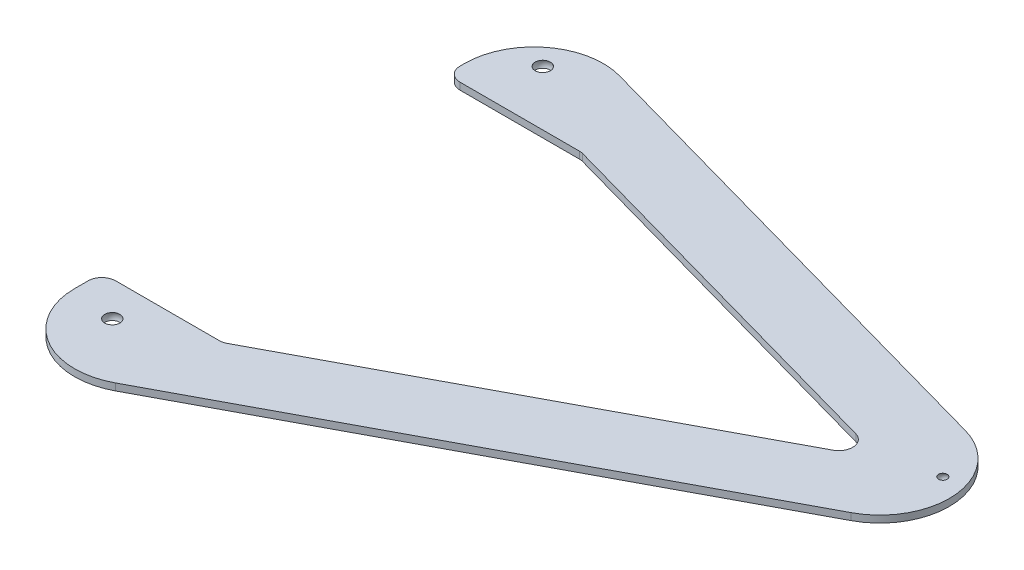
ISO-10303-21;
HEADER;
FILE_DESCRIPTION(('STEP AP214'),'2;1');
FILE_NAME('part.step','',(''),(''),'','','');
FILE_SCHEMA(('AUTOMOTIVE_DESIGN { 1 0 10303 214 1 1 1 1 }'));
ENDSEC;
DATA;
#1=APPLICATION_CONTEXT('core data for automotive mechanical design processes');
#2=APPLICATION_PROTOCOL_DEFINITION('international standard','automotive_design',2000,#1);
#3=PRODUCT_CONTEXT('',#1,'mechanical');
#4=PRODUCT('Part','Part','',(#3));
#5=PRODUCT_RELATED_PRODUCT_CATEGORY('part','',(#4));
#6=PRODUCT_DEFINITION_FORMATION('','',#4);
#7=PRODUCT_DEFINITION_CONTEXT('part definition',#1,'design');
#8=PRODUCT_DEFINITION('design','',#6,#7);
#9=PRODUCT_DEFINITION_SHAPE('','',#8);
#10=(LENGTH_UNIT() NAMED_UNIT(*) SI_UNIT(.MILLI.,.METRE.));
#11=(NAMED_UNIT(*) PLANE_ANGLE_UNIT() SI_UNIT($,.RADIAN.));
#12=(NAMED_UNIT(*) SI_UNIT($,.STERADIAN.) SOLID_ANGLE_UNIT());
#13=UNCERTAINTY_MEASURE_WITH_UNIT(LENGTH_MEASURE(1.E-05),#10,'distance_accuracy_value','');
#14=(GEOMETRIC_REPRESENTATION_CONTEXT(3) GLOBAL_UNCERTAINTY_ASSIGNED_CONTEXT((#13)) GLOBAL_UNIT_ASSIGNED_CONTEXT((#10,
#11,#12)) REPRESENTATION_CONTEXT('',''));
#15=CARTESIAN_POINT('',(0.,0.,0.));
#16=DIRECTION('',(0.,0.,1.));
#17=DIRECTION('',(1.,0.,0.));
#18=AXIS2_PLACEMENT_3D('',#15,#16,#17);
#19=CARTESIAN_POINT('',(0.,5.,0.));
#20=DIRECTION('',(-1.,0.,0.));
#21=DIRECTION('',(0.,0.,1.));
#22=AXIS2_PLACEMENT_3D('',#19,#20,#21);
#23=PLANE('',#22);
#24=DIRECTION('',(0.,0.,-1.));
#25=VECTOR('',#24,1.);
#26=CARTESIAN_POINT('',(0.,0.,0.));
#27=LINE('',#26,#25);
#28=CARTESIAN_POINT('',(0.,0.,-360.837718086647));
#29=VERTEX_POINT('',#28);
#30=CARTESIAN_POINT('',(0.,0.,-364.097258810454));
#31=VERTEX_POINT('',#30);
#32=EDGE_CURVE('E286',#29,#31,#27,.T.);
#33=ORIENTED_EDGE('',*,*,#32,.F.);
#34=DIRECTION('',(0.,-1.,0.));
#35=VECTOR('',#34,1.);
#36=CARTESIAN_POINT('',(0.,5.,-360.837718086647));
#37=LINE('',#36,#35);
#38=CARTESIAN_POINT('',(0.,5.,-360.837718086647));
#39=VERTEX_POINT('',#38);
#40=EDGE_CURVE('E239',#29,#39,#37,.F.);
#41=ORIENTED_EDGE('',*,*,#40,.T.);
#42=DIRECTION('',(0.,0.,-1.));
#43=VECTOR('',#42,1.);
#44=CARTESIAN_POINT('',(0.,5.,0.));
#45=LINE('',#44,#43);
#46=CARTESIAN_POINT('',(0.,5.,-364.097258810454));
#47=VERTEX_POINT('',#46);
#48=EDGE_CURVE('E161',#39,#47,#45,.T.);
#49=ORIENTED_EDGE('',*,*,#48,.T.);
#50=DIRECTION('',(0.,-1.,0.));
#51=VECTOR('',#50,1.);
#52=CARTESIAN_POINT('',(0.,5.,-364.097258810454));
#53=LINE('',#52,#51);
#54=EDGE_CURVE('E171',#47,#31,#53,.T.);
#55=ORIENTED_EDGE('',*,*,#54,.T.);
#56=EDGE_LOOP('',(#33,#41,#49,#55));
#57=FACE_BOUND('',#56,.T.);
#58=ADVANCED_FACE('F37',(#57),#23,.T.);
#59=CARTESIAN_POINT('',(0.,5.,-83.245567818374));
#60=VERTEX_POINT('',#59);
#61=CARTESIAN_POINT('',(0.,5.,-92.9222846828418));
#62=VERTEX_POINT('',#61);
#63=EDGE_CURVE('E287',#60,#62,#45,.T.);
#64=ORIENTED_EDGE('',*,*,#63,.T.);
#65=DIRECTION('',(0.,1.,0.));
#66=VECTOR('',#65,1.);
#67=CARTESIAN_POINT('',(0.,0.,-92.9222846828418));
#68=LINE('',#67,#66);
#69=CARTESIAN_POINT('',(0.,0.,-92.9222846828418));
#70=VERTEX_POINT('',#69);
#71=EDGE_CURVE('E227',#62,#70,#68,.F.);
#72=ORIENTED_EDGE('',*,*,#71,.T.);
#73=CARTESIAN_POINT('',(0.,0.,-83.245567818374));
#74=VERTEX_POINT('',#73);
#75=EDGE_CURVE('E292',#74,#70,#27,.T.);
#76=ORIENTED_EDGE('',*,*,#75,.F.);
#77=DIRECTION('',(0.,-1.,0.));
#78=VECTOR('',#77,1.);
#79=CARTESIAN_POINT('',(0.,5.,-83.245567818374));
#80=LINE('',#79,#78);
#81=EDGE_CURVE('E170',#74,#60,#80,.F.);
#82=ORIENTED_EDGE('',*,*,#81,.T.);
#83=EDGE_LOOP('',(#64,#72,#76,#82));
#84=FACE_BOUND('',#83,.T.);
#85=ADVANCED_FACE('F312',(#84),#23,.T.);
#86=CARTESIAN_POINT('',(529.674124537375,5.,-281.860465116279));
#87=DIRECTION('',(0.469767441860465,0.,0.882790207562292));
#88=DIRECTION('',(0.882790207562292,0.,-0.469767441860465));
#89=AXIS2_PLACEMENT_3D('',#86,#87,#88);
#90=PLANE('',#89);
#91=DIRECTION('',(-0.882790207562292,0.,0.469767441860465));
#92=VECTOR('',#91,1.);
#93=CARTESIAN_POINT('',(529.674124537375,0.,-281.860465116279));
#94=LINE('',#93,#92);
#95=CARTESIAN_POINT('',(419.44156639784,0.,-223.20137895589));
#96=VERTEX_POINT('',#95);
#97=CARTESIAN_POINT('',(73.4883720930232,0.,-39.1060574402594));
#98=VERTEX_POINT('',#97);
#99=EDGE_CURVE('E149',#96,#98,#94,.T.);
#100=ORIENTED_EDGE('',*,*,#99,.F.);
#101=DIRECTION('',(0.,-1.,0.));
#102=VECTOR('',#101,1.);
#103=CARTESIAN_POINT('',(419.44156639784,5.,-223.20137895589));
#104=LINE('',#103,#102);
#105=CARTESIAN_POINT('',(419.44156639784,5.,-223.20137895589));
#106=VERTEX_POINT('',#105);
#107=EDGE_CURVE('E211',#96,#106,#104,.F.);
#108=ORIENTED_EDGE('',*,*,#107,.T.);
#109=DIRECTION('',(-0.882790207562292,0.,0.469767441860465));
#110=VECTOR('',#109,1.);
#111=CARTESIAN_POINT('',(529.674124537375,5.,-281.860465116279));
#112=LINE('',#111,#110);
#113=CARTESIAN_POINT('',(73.4883720930232,5.,-39.1060574402594));
#114=VERTEX_POINT('',#113);
#115=EDGE_CURVE('E176',#106,#114,#112,.T.);
#116=ORIENTED_EDGE('',*,*,#115,.T.);
#117=DIRECTION('',(0.,-1.,0.));
#118=VECTOR('',#117,1.);
#119=CARTESIAN_POINT('',(73.4883720930232,5.,-39.1060574402594));
#120=LINE('',#119,#118);
#121=EDGE_CURVE('E169',#114,#98,#120,.T.);
#122=ORIENTED_EDGE('',*,*,#121,.T.);
#123=EDGE_LOOP('',(#100,#108,#116,#122));
#124=FACE_BOUND('',#123,.T.);
#125=ADVANCED_FACE('F174',(#124),#90,.T.);
#126=CARTESIAN_POINT('',(0.,5.,-430.));
#127=DIRECTION('',(0.269344608879493,0.,-0.963043862795228));
#128=DIRECTION('',(-0.963043862795228,0.,-0.269344608879493));
#129=AXIS2_PLACEMENT_3D('',#126,#127,#128);
#130=PLANE('',#129);
#131=DIRECTION('',(0.963043862795228,0.,0.269344608879493));
#132=VECTOR('',#131,1.);
#133=CARTESIAN_POINT('',(0.,5.,-430.));
#134=LINE('',#133,#132);
#135=CARTESIAN_POINT('',(63.4672304439746,5.,-412.249451950215));
#136=VERTEX_POINT('',#135);
#137=CARTESIAN_POINT('',(409.420424748792,5.,-315.493082473766));
#138=VERTEX_POINT('',#137);
#139=EDGE_CURVE('E180',#136,#138,#134,.T.);
#140=ORIENTED_EDGE('',*,*,#139,.T.);
#141=DIRECTION('',(0.,-1.,0.));
#142=VECTOR('',#141,1.);
#143=CARTESIAN_POINT('',(409.420424748792,5.,-315.493082473766));
#144=LINE('',#143,#142);
#145=CARTESIAN_POINT('',(409.420424748792,0.,-315.493082473766));
#146=VERTEX_POINT('',#145);
#147=EDGE_CURVE('E194',#138,#146,#144,.T.);
#148=ORIENTED_EDGE('',*,*,#147,.T.);
#149=DIRECTION('',(0.963043862795228,0.,0.269344608879493));
#150=VECTOR('',#149,1.);
#151=CARTESIAN_POINT('',(0.,0.,-430.));
#152=LINE('',#151,#150);
#153=CARTESIAN_POINT('',(63.4672304439746,0.,-412.249451950215));
#154=VERTEX_POINT('',#153);
#155=EDGE_CURVE('E162',#154,#146,#152,.T.);
#156=ORIENTED_EDGE('',*,*,#155,.F.);
#157=DIRECTION('',(0.,-1.,0.));
#158=VECTOR('',#157,1.);
#159=CARTESIAN_POINT('',(63.4672304439746,5.,-412.249451950215));
#160=LINE('',#159,#158);
#161=EDGE_CURVE('E192',#154,#136,#160,.F.);
#162=ORIENTED_EDGE('',*,*,#161,.T.);
#163=EDGE_LOOP('',(#140,#148,#156,#162));
#164=FACE_BOUND('',#163,.T.);
#165=ADVANCED_FACE('F297',(#164),#130,.T.);
#166=CARTESIAN_POINT('',(0.,5.,0.));
#167=DIRECTION('',(0.,-1.,0.));
#168=DIRECTION('',(0.,0.,-1.));
#169=AXIS2_PLACEMENT_3D('',#166,#167,#168);
#170=PLANE('',#169);
#171=CARTESIAN_POINT('',(30.,5.,-390.458355286272));
#172=DIRECTION('',(0.,-1.,0.));
#173=DIRECTION('',(0.,0.,-1.));
#174=AXIS2_PLACEMENT_3D('',#171,#172,#173);
#175=CIRCLE('',#174,5.45435605731786);
#176=CARTESIAN_POINT('',(30.,5.,-395.91271134359));
#177=VERTEX_POINT('',#176);
#178=EDGE_CURVE('E203',#177,#177,#175,.T.);
#179=ORIENTED_EDGE('',*,*,#178,.T.);
#180=EDGE_LOOP('',(#179));
#181=FACE_BOUND('',#180,.T.);
#182=CARTESIAN_POINT('',(430.048420605137,5.,-278.572604757731));
#183=DIRECTION('',(0.,-1.,0.));
#184=DIRECTION('',(0.,0.,-1.));
#185=AXIS2_PLACEMENT_3D('',#182,#183,#184);
#186=CIRCLE('',#185,3.12249899919916);
#187=CARTESIAN_POINT('',(430.048420605137,5.,-281.69510375693));
#188=VERTEX_POINT('',#187);
#189=EDGE_CURVE('E199',#188,#188,#186,.T.);
#190=ORIENTED_EDGE('',*,*,#189,.T.);
#191=EDGE_LOOP('',(#190));
#192=FACE_BOUND('',#191,.T.);
#193=CARTESIAN_POINT('',(32.3309254607989,5.,-78.0683552862724));
#194=DIRECTION('',(0.,-1.,0.));
#195=DIRECTION('',(0.,0.,-1.));
#196=AXIS2_PLACEMENT_3D('',#193,#194,#195);
#197=CIRCLE('',#196,5.45435605731786);
#198=CARTESIAN_POINT('',(32.3309254607989,5.,-83.5227113435902));
#199=VERTEX_POINT('',#198);
#200=EDGE_CURVE('E198',#199,#199,#197,.T.);
#201=ORIENTED_EDGE('',*,*,#200,.T.);
#202=EDGE_LOOP('',(#201));
#203=FACE_BOUND('',#202,.T.);
#204=DIRECTION('',(1.,0.,0.));
#205=VECTOR('',#204,1.);
#206=CARTESIAN_POINT('',(86.976621658015,5.,-102.922284682842));
#207=LINE('',#206,#205);
#208=CARTESIAN_POINT('',(9.99999999999999,5.,-102.922284682842));
#209=VERTEX_POINT('',#208);
#210=CARTESIAN_POINT('',(84.4815617199846,5.,-102.922284682842));
#211=VERTEX_POINT('',#210);
#212=EDGE_CURVE('E276',#209,#211,#207,.T.);
#213=ORIENTED_EDGE('',*,*,#212,.F.);
#214=CARTESIAN_POINT('',(9.99999999999999,5.,-92.9222846828418));
#215=DIRECTION('',(0.,-1.,0.));
#216=DIRECTION('',(0.,0.,-1.));
#217=AXIS2_PLACEMENT_3D('',#214,#215,#216);
#218=CIRCLE('',#217,10.);
#219=EDGE_CURVE('E225',#209,#62,#218,.F.);
#220=ORIENTED_EDGE('',*,*,#219,.T.);
#221=ORIENTED_EDGE('',*,*,#63,.F.);
#222=CARTESIAN_POINT('',(50.,5.,-83.245567818374));
#223=DIRECTION('',(0.,-1.,0.));
#224=DIRECTION('',(0.,0.,-1.));
#225=AXIS2_PLACEMENT_3D('',#222,#223,#224);
#226=CIRCLE('',#225,50.);
#227=EDGE_CURVE('E190',#60,#114,#226,.F.);
#228=ORIENTED_EDGE('',*,*,#227,.T.);
#229=ORIENTED_EDGE('',*,*,#115,.F.);
#230=CARTESIAN_POINT('',(395.953194304817,5.,-267.340889334004));
#231=DIRECTION('',(0.,-1.,0.));
#232=DIRECTION('',(0.,0.,-1.));
#233=AXIS2_PLACEMENT_3D('',#230,#231,#232);
#234=CIRCLE('',#233,50.);
#235=EDGE_CURVE('E213',#106,#138,#234,.F.);
#236=ORIENTED_EDGE('',*,*,#235,.T.);
#237=ORIENTED_EDGE('',*,*,#139,.F.);
#238=CARTESIAN_POINT('',(50.,5.,-364.097258810454));
#239=DIRECTION('',(0.,-1.,0.));
#240=DIRECTION('',(0.,0.,-1.));
#241=AXIS2_PLACEMENT_3D('',#238,#239,#240);
#242=CIRCLE('',#241,50.);
#243=EDGE_CURVE('E187',#136,#47,#242,.F.);
#244=ORIENTED_EDGE('',*,*,#243,.T.);
#245=ORIENTED_EDGE('',*,*,#48,.F.);
#246=CARTESIAN_POINT('',(10.,5.,-360.837718086647));
#247=DIRECTION('',(0.,-1.,0.));
#248=DIRECTION('',(0.,0.,-1.));
#249=AXIS2_PLACEMENT_3D('',#246,#247,#248);
#250=CIRCLE('',#249,10.);
#251=CARTESIAN_POINT('',(9.99999999999999,5.,-350.837718086647));
#252=VERTEX_POINT('',#251);
#253=EDGE_CURVE('E223',#39,#252,#250,.F.);
#254=ORIENTED_EDGE('',*,*,#253,.T.);
#255=DIRECTION('',(-1.,0.,0.));
#256=VECTOR('',#255,1.);
#257=CARTESIAN_POINT('',(-31.4392731433338,5.,-350.837718086647));
#258=LINE('',#257,#256);
#259=CARTESIAN_POINT('',(96.0375204726878,5.,-350.837718086647));
#260=VERTEX_POINT('',#259);
#261=EDGE_CURVE('E330',#260,#252,#258,.T.);
#262=ORIENTED_EDGE('',*,*,#261,.F.);
#263=CARTESIAN_POINT('',(96.0375204726878,5.,-340.837718086647));
#264=DIRECTION('',(0.,-1.,0.));
#265=DIRECTION('',(0.,0.,-1.));
#266=AXIS2_PLACEMENT_3D('',#263,#264,#265);
#267=CIRCLE('',#266,10.);
#268=CARTESIAN_POINT('',(98.7309665614828,5.,-350.468156714599));
#269=VERTEX_POINT('',#268);
#270=EDGE_CURVE('E251',#260,#269,#267,.T.);
#271=ORIENTED_EDGE('',*,*,#270,.T.);
#272=DIRECTION('',(-0.963043862795227,0.,-0.269344608879493));
#273=VECTOR('',#272,1.);
#274=CARTESIAN_POINT('',(97.4095968382967,5.,-350.837718086647));
#275=LINE('',#274,#273);
#276=CARTESIAN_POINT('',(371.9024543471,5.,-274.067412805502));
#277=VERTEX_POINT('',#276);
#278=EDGE_CURVE('E263',#277,#269,#275,.T.);
#279=ORIENTED_EDGE('',*,*,#278,.F.);
#280=CARTESIAN_POINT('',(369.209008258306,5.,-264.43697417755));
#281=DIRECTION('',(0.,-1.,0.));
#282=DIRECTION('',(0.,0.,-1.));
#283=AXIS2_PLACEMENT_3D('',#280,#281,#282);
#284=CIRCLE('',#283,10.);
#285=CARTESIAN_POINT('',(373.90668267691,5.,-255.609072101927));
#286=VERTEX_POINT('',#285);
#287=EDGE_CURVE('E45',#277,#286,#284,.T.);
#288=ORIENTED_EDGE('',*,*,#287,.T.);
#289=DIRECTION('',(0.882790207562292,0.,-0.469767441860465));
#290=VECTOR('',#289,1.);
#291=CARTESIAN_POINT('',(395.953194304817,5.,-267.340889334004));
#292=LINE('',#291,#290);
#293=CARTESIAN_POINT('',(89.1792361385893,5.,-104.094382607219));
#294=VERTEX_POINT('',#293);
#295=EDGE_CURVE('E271',#294,#286,#292,.T.);
#296=ORIENTED_EDGE('',*,*,#295,.F.);
#297=CARTESIAN_POINT('',(84.4815617199846,5.,-112.922284682842));
#298=DIRECTION('',(0.,-1.,0.));
#299=DIRECTION('',(0.,0.,-1.));
#300=AXIS2_PLACEMENT_3D('',#297,#298,#299);
#301=CIRCLE('',#300,10.);
#302=EDGE_CURVE('E247',#294,#211,#301,.T.);
#303=ORIENTED_EDGE('',*,*,#302,.T.);
#304=EDGE_LOOP('',(#213,#220,#221,#228,#229,#236,#237,#244,#245,#254,#262,#271,#279,#288,#296,#303));
#305=FACE_BOUND('',#304,.T.);
#306=ADVANCED_FACE('F267',(#181,#192,#203,#305),#170,.F.);
#307=CARTESIAN_POINT('',(0.,0.,0.));
#308=DIRECTION('',(0.,-1.,0.));
#309=DIRECTION('',(0.,0.,-1.));
#310=AXIS2_PLACEMENT_3D('',#307,#308,#309);
#311=PLANE('',#310);
#312=ORIENTED_EDGE('',*,*,#75,.T.);
#313=CARTESIAN_POINT('',(9.99999999999999,0.,-92.9222846828418));
#314=DIRECTION('',(0.,-1.,0.));
#315=DIRECTION('',(0.,0.,-1.));
#316=AXIS2_PLACEMENT_3D('',#313,#314,#315);
#317=CIRCLE('',#316,10.);
#318=CARTESIAN_POINT('',(9.99999999999999,0.,-102.922284682842));
#319=VERTEX_POINT('',#318);
#320=EDGE_CURVE('E231',#70,#319,#317,.T.);
#321=ORIENTED_EDGE('',*,*,#320,.T.);
#322=DIRECTION('',(-1.,0.,0.));
#323=VECTOR('',#322,1.);
#324=CARTESIAN_POINT('',(0.,0.,-102.922284682842));
#325=LINE('',#324,#323);
#326=CARTESIAN_POINT('',(84.4815617199846,0.,-102.922284682842));
#327=VERTEX_POINT('',#326);
#328=EDGE_CURVE('E215',#327,#319,#325,.T.);
#329=ORIENTED_EDGE('',*,*,#328,.F.);
#330=CARTESIAN_POINT('',(84.4815617199846,0.,-112.922284682842));
#331=DIRECTION('',(0.,-1.,0.));
#332=DIRECTION('',(0.,0.,-1.));
#333=AXIS2_PLACEMENT_3D('',#330,#331,#332);
#334=CIRCLE('',#333,10.);
#335=CARTESIAN_POINT('',(89.1792361385893,0.,-104.094382607219));
#336=VERTEX_POINT('',#335);
#337=EDGE_CURVE('E249',#327,#336,#334,.F.);
#338=ORIENTED_EDGE('',*,*,#337,.T.);
#339=DIRECTION('',(0.882790207562292,0.,-0.469767441860465));
#340=VECTOR('',#339,1.);
#341=CARTESIAN_POINT('',(395.953194304817,0.,-267.340889334004));
#342=LINE('',#341,#340);
#343=CARTESIAN_POINT('',(373.90668267691,0.,-255.609072101927));
#344=VERTEX_POINT('',#343);
#345=EDGE_CURVE('E274',#336,#344,#342,.T.);
#346=ORIENTED_EDGE('',*,*,#345,.T.);
#347=CARTESIAN_POINT('',(369.209008258306,0.,-264.43697417755));
#348=DIRECTION('',(0.,-1.,0.));
#349=DIRECTION('',(0.,0.,-1.));
#350=AXIS2_PLACEMENT_3D('',#347,#348,#349);
#351=CIRCLE('',#350,10.);
#352=CARTESIAN_POINT('',(371.9024543471,0.,-274.067412805502));
#353=VERTEX_POINT('',#352);
#354=EDGE_CURVE('E11',#344,#353,#351,.F.);
#355=ORIENTED_EDGE('',*,*,#354,.T.);
#356=DIRECTION('',(-0.963043862795227,0.,-0.269344608879493));
#357=VECTOR('',#356,1.);
#358=CARTESIAN_POINT('',(97.4095968382967,0.,-350.837718086647));
#359=LINE('',#358,#357);
#360=CARTESIAN_POINT('',(98.7309665614828,0.,-350.468156714599));
#361=VERTEX_POINT('',#360);
#362=EDGE_CURVE('E207',#353,#361,#359,.T.);
#363=ORIENTED_EDGE('',*,*,#362,.T.);
#364=CARTESIAN_POINT('',(96.0375204726878,0.,-340.837718086647));
#365=DIRECTION('',(0.,-1.,0.));
#366=DIRECTION('',(0.,0.,-1.));
#367=AXIS2_PLACEMENT_3D('',#364,#365,#366);
#368=CIRCLE('',#367,10.);
#369=CARTESIAN_POINT('',(96.0375204726878,0.,-350.837718086647));
#370=VERTEX_POINT('',#369);
#371=EDGE_CURVE('E254',#361,#370,#368,.F.);
#372=ORIENTED_EDGE('',*,*,#371,.T.);
#373=DIRECTION('',(-1.,0.,0.));
#374=VECTOR('',#373,1.);
#375=CARTESIAN_POINT('',(-31.4392731433338,0.,-350.837718086647));
#376=LINE('',#375,#374);
#377=CARTESIAN_POINT('',(9.99999999999999,0.,-350.837718086647));
#378=VERTEX_POINT('',#377);
#379=EDGE_CURVE('E270',#370,#378,#376,.T.);
#380=ORIENTED_EDGE('',*,*,#379,.T.);
#381=CARTESIAN_POINT('',(10.,0.,-360.837718086647));
#382=DIRECTION('',(0.,-1.,0.));
#383=DIRECTION('',(0.,0.,-1.));
#384=AXIS2_PLACEMENT_3D('',#381,#382,#383);
#385=CIRCLE('',#384,10.);
#386=EDGE_CURVE('E229',#378,#29,#385,.T.);
#387=ORIENTED_EDGE('',*,*,#386,.T.);
#388=ORIENTED_EDGE('',*,*,#32,.T.);
#389=CARTESIAN_POINT('',(50.,0.,-364.097258810454));
#390=DIRECTION('',(0.,-1.,0.));
#391=DIRECTION('',(0.,0.,-1.));
#392=AXIS2_PLACEMENT_3D('',#389,#390,#391);
#393=CIRCLE('',#392,50.);
#394=EDGE_CURVE('E172',#31,#154,#393,.T.);
#395=ORIENTED_EDGE('',*,*,#394,.T.);
#396=ORIENTED_EDGE('',*,*,#155,.T.);
#397=CARTESIAN_POINT('',(395.953194304817,0.,-267.340889334004));
#398=DIRECTION('',(0.,-1.,0.));
#399=DIRECTION('',(0.,0.,-1.));
#400=AXIS2_PLACEMENT_3D('',#397,#398,#399);
#401=CIRCLE('',#400,50.);
#402=EDGE_CURVE('E157',#146,#96,#401,.T.);
#403=ORIENTED_EDGE('',*,*,#402,.T.);
#404=ORIENTED_EDGE('',*,*,#99,.T.);
#405=CARTESIAN_POINT('',(50.,0.,-83.245567818374));
#406=DIRECTION('',(0.,-1.,0.));
#407=DIRECTION('',(0.,0.,-1.));
#408=AXIS2_PLACEMENT_3D('',#405,#406,#407);
#409=CIRCLE('',#408,50.);
#410=EDGE_CURVE('E154',#98,#74,#409,.T.);
#411=ORIENTED_EDGE('',*,*,#410,.T.);
#412=EDGE_LOOP('',(#312,#321,#329,#338,#346,#355,#363,#372,#380,#387,#388,#395,#396,#403,#404,#411));
#413=FACE_BOUND('',#412,.T.);
#414=CARTESIAN_POINT('',(30.,0.,-390.458355286272));
#415=DIRECTION('',(0.,-1.,0.));
#416=DIRECTION('',(0.,0.,-1.));
#417=AXIS2_PLACEMENT_3D('',#414,#415,#416);
#418=CIRCLE('',#417,5.45435605731786);
#419=CARTESIAN_POINT('',(30.,0.,-395.91271134359));
#420=VERTEX_POINT('',#419);
#421=EDGE_CURVE('E204',#420,#420,#418,.T.);
#422=ORIENTED_EDGE('',*,*,#421,.F.);
#423=EDGE_LOOP('',(#422));
#424=FACE_BOUND('',#423,.T.);
#425=CARTESIAN_POINT('',(430.048420605137,0.,-278.572604757731));
#426=DIRECTION('',(0.,-1.,0.));
#427=DIRECTION('',(0.,0.,-1.));
#428=AXIS2_PLACEMENT_3D('',#425,#426,#427);
#429=CIRCLE('',#428,3.12249899919916);
#430=CARTESIAN_POINT('',(430.048420605137,0.,-281.69510375693));
#431=VERTEX_POINT('',#430);
#432=EDGE_CURVE('E200',#431,#431,#429,.T.);
#433=ORIENTED_EDGE('',*,*,#432,.F.);
#434=EDGE_LOOP('',(#433));
#435=FACE_BOUND('',#434,.T.);
#436=CARTESIAN_POINT('',(32.3309254607989,0.,-78.0683552862724));
#437=DIRECTION('',(0.,-1.,0.));
#438=DIRECTION('',(0.,0.,-1.));
#439=AXIS2_PLACEMENT_3D('',#436,#437,#438);
#440=CIRCLE('',#439,5.45435605731786);
#441=CARTESIAN_POINT('',(32.3309254607989,0.,-83.5227113435902));
#442=VERTEX_POINT('',#441);
#443=EDGE_CURVE('E195',#442,#442,#440,.T.);
#444=ORIENTED_EDGE('',*,*,#443,.F.);
#445=EDGE_LOOP('',(#444));
#446=FACE_BOUND('',#445,.T.);
#447=ADVANCED_FACE('F152',(#413,#424,#435,#446),#311,.T.);
#448=CARTESIAN_POINT('',(50.,5.,-83.245567818374));
#449=DIRECTION('',(0.,-1.,0.));
#450=DIRECTION('',(0.,0.,-1.));
#451=AXIS2_PLACEMENT_3D('',#448,#449,#450);
#452=CYLINDRICAL_SURFACE('',#451,50.);
#453=ORIENTED_EDGE('',*,*,#227,.F.);
#454=ORIENTED_EDGE('',*,*,#81,.F.);
#455=ORIENTED_EDGE('',*,*,#410,.F.);
#456=ORIENTED_EDGE('',*,*,#121,.F.);
#457=EDGE_LOOP('',(#453,#454,#455,#456));
#458=FACE_BOUND('',#457,.T.);
#459=ADVANCED_FACE('F168',(#458),#452,.T.);
#460=CARTESIAN_POINT('',(50.,5.,-364.097258810454));
#461=DIRECTION('',(0.,-1.,0.));
#462=DIRECTION('',(0.,0.,-1.));
#463=AXIS2_PLACEMENT_3D('',#460,#461,#462);
#464=CYLINDRICAL_SURFACE('',#463,50.);
#465=ORIENTED_EDGE('',*,*,#243,.F.);
#466=ORIENTED_EDGE('',*,*,#161,.F.);
#467=ORIENTED_EDGE('',*,*,#394,.F.);
#468=ORIENTED_EDGE('',*,*,#54,.F.);
#469=EDGE_LOOP('',(#465,#466,#467,#468));
#470=FACE_BOUND('',#469,.T.);
#471=ADVANCED_FACE('F302',(#470),#464,.T.);
#472=CARTESIAN_POINT('',(32.3309254607989,2.5,-78.0683552862724));
#473=DIRECTION('',(0.,0.,-1.));
#474=DIRECTION('',(-1.,0.,0.));
#475=AXIS2_PLACEMENT_3D('',#472,#473,#474);
#476=SPHERICAL_SURFACE('',#475,6.);
#477=CARTESIAN_POINT('',(32.3309254607989,2.5,-78.0683552862724));
#478=DIRECTION('',(0.,-1.,0.));
#479=DIRECTION('',(0.,0.,-1.));
#480=AXIS2_PLACEMENT_3D('',#477,#478,#479);
#481=SPHERICAL_SURFACE('',#480,6.);
#482=ORIENTED_EDGE('',*,*,#443,.T.);
#483=EDGE_LOOP('',(#482));
#484=FACE_BOUND('',#483,.T.);
#485=ORIENTED_EDGE('',*,*,#200,.F.);
#486=EDGE_LOOP('',(#485));
#487=FACE_BOUND('',#486,.T.);
#488=ADVANCED_FACE('F354',(#484,#487),#481,.F.);
#489=CARTESIAN_POINT('',(430.048420605137,2.5,-278.572604757731));
#490=DIRECTION('',(0.340590432617696,0.,-0.94021176189691));
#491=DIRECTION('',(-0.94021176189691,0.,-0.340590432617696));
#492=AXIS2_PLACEMENT_3D('',#489,#490,#491);
#493=SPHERICAL_SURFACE('',#492,3.99999999999997);
#494=CARTESIAN_POINT('',(430.048420605137,2.5,-278.572604757731));
#495=DIRECTION('',(0.,-1.,0.));
#496=DIRECTION('',(0.,0.,-1.));
#497=AXIS2_PLACEMENT_3D('',#494,#495,#496);
#498=SPHERICAL_SURFACE('',#497,3.99999999999997);
#499=ORIENTED_EDGE('',*,*,#432,.T.);
#500=EDGE_LOOP('',(#499));
#501=FACE_BOUND('',#500,.T.);
#502=ORIENTED_EDGE('',*,*,#189,.F.);
#503=EDGE_LOOP('',(#502));
#504=FACE_BOUND('',#503,.T.);
#505=ADVANCED_FACE('F483',(#501,#504),#498,.F.);
#506=CARTESIAN_POINT('',(30.,2.5,-390.458355286272));
#507=DIRECTION('',(-0.4495605492634,0.,0.893249860087305));
#508=DIRECTION('',(0.893249860087305,0.,0.4495605492634));
#509=AXIS2_PLACEMENT_3D('',#506,#507,#508);
#510=SPHERICAL_SURFACE('',#509,6.);
#511=CARTESIAN_POINT('',(30.,2.5,-390.458355286272));
#512=DIRECTION('',(0.,-1.,0.));
#513=DIRECTION('',(0.,0.,-1.));
#514=AXIS2_PLACEMENT_3D('',#511,#512,#513);
#515=SPHERICAL_SURFACE('',#514,6.);
#516=ORIENTED_EDGE('',*,*,#421,.T.);
#517=EDGE_LOOP('',(#516));
#518=FACE_BOUND('',#517,.T.);
#519=ORIENTED_EDGE('',*,*,#178,.F.);
#520=EDGE_LOOP('',(#519));
#521=FACE_BOUND('',#520,.T.);
#522=ADVANCED_FACE('F357',(#518,#521),#515,.F.);
#523=CARTESIAN_POINT('',(395.953194304817,5.,-267.340889334004));
#524=DIRECTION('',(0.,-1.,0.));
#525=DIRECTION('',(0.,0.,-1.));
#526=AXIS2_PLACEMENT_3D('',#523,#524,#525);
#527=CYLINDRICAL_SURFACE('',#526,50.);
#528=ORIENTED_EDGE('',*,*,#235,.F.);
#529=ORIENTED_EDGE('',*,*,#107,.F.);
#530=ORIENTED_EDGE('',*,*,#402,.F.);
#531=ORIENTED_EDGE('',*,*,#147,.F.);
#532=EDGE_LOOP('',(#528,#529,#530,#531));
#533=FACE_BOUND('',#532,.T.);
#534=ADVANCED_FACE('F308',(#533),#527,.T.);
#535=CARTESIAN_POINT('',(-31.4392731433338,0.,-350.837718086647));
#536=DIRECTION('',(0.,0.,-1.));
#537=DIRECTION('',(-1.,0.,0.));
#538=AXIS2_PLACEMENT_3D('',#535,#536,#537);
#539=PLANE('',#538);
#540=ORIENTED_EDGE('',*,*,#261,.T.);
#541=DIRECTION('',(0.,-1.,0.));
#542=VECTOR('',#541,1.);
#543=CARTESIAN_POINT('',(10.,0.,-350.837718086647));
#544=LINE('',#543,#542);
#545=EDGE_CURVE('E236',#252,#378,#544,.T.);
#546=ORIENTED_EDGE('',*,*,#545,.T.);
#547=ORIENTED_EDGE('',*,*,#379,.F.);
#548=DIRECTION('',(0.,1.,0.));
#549=VECTOR('',#548,1.);
#550=CARTESIAN_POINT('',(96.0375204726878,5.,-350.837718086647));
#551=LINE('',#550,#549);
#552=EDGE_CURVE('E233',#370,#260,#551,.T.);
#553=ORIENTED_EDGE('',*,*,#552,.T.);
#554=EDGE_LOOP('',(#540,#546,#547,#553));
#555=FACE_BOUND('',#554,.T.);
#556=ADVANCED_FACE('F334',(#555),#539,.F.);
#557=CARTESIAN_POINT('',(97.4095968382967,0.,-350.837718086647));
#558=DIRECTION('',(0.269344608879493,0.,-0.963043862795227));
#559=DIRECTION('',(-0.963043862795228,0.,-0.269344608879493));
#560=AXIS2_PLACEMENT_3D('',#557,#558,#559);
#561=PLANE('',#560);
#562=ORIENTED_EDGE('',*,*,#362,.F.);
#563=DIRECTION('',(0.,1.,0.));
#564=VECTOR('',#563,1.);
#565=CARTESIAN_POINT('',(371.9024543471,5.,-274.067412805502));
#566=LINE('',#565,#564);
#567=EDGE_CURVE('E256',#353,#277,#566,.T.);
#568=ORIENTED_EDGE('',*,*,#567,.T.);
#569=ORIENTED_EDGE('',*,*,#278,.T.);
#570=DIRECTION('',(0.,1.,0.));
#571=VECTOR('',#570,1.);
#572=CARTESIAN_POINT('',(98.7309665614828,0.,-350.468156714599));
#573=LINE('',#572,#571);
#574=EDGE_CURVE('E244',#269,#361,#573,.F.);
#575=ORIENTED_EDGE('',*,*,#574,.T.);
#576=EDGE_LOOP('',(#562,#568,#569,#575));
#577=FACE_BOUND('',#576,.T.);
#578=ADVANCED_FACE('F262',(#577),#561,.F.);
#579=CARTESIAN_POINT('',(395.953194304817,0.,-267.340889334004));
#580=DIRECTION('',(0.469767441860465,0.,0.882790207562292));
#581=DIRECTION('',(0.882790207562292,0.,-0.469767441860465));
#582=AXIS2_PLACEMENT_3D('',#579,#580,#581);
#583=PLANE('',#582);
#584=ORIENTED_EDGE('',*,*,#295,.T.);
#585=DIRECTION('',(0.,1.,0.));
#586=VECTOR('',#585,1.);
#587=CARTESIAN_POINT('',(373.90668267691,0.,-255.609072101927));
#588=LINE('',#587,#586);
#589=EDGE_CURVE('E58',#286,#344,#588,.F.);
#590=ORIENTED_EDGE('',*,*,#589,.T.);
#591=ORIENTED_EDGE('',*,*,#345,.F.);
#592=DIRECTION('',(0.,1.,0.));
#593=VECTOR('',#592,1.);
#594=CARTESIAN_POINT('',(89.1792361385892,5.,-104.094382607219));
#595=LINE('',#594,#593);
#596=EDGE_CURVE('E241',#336,#294,#595,.T.);
#597=ORIENTED_EDGE('',*,*,#596,.T.);
#598=EDGE_LOOP('',(#584,#590,#591,#597));
#599=FACE_BOUND('',#598,.T.);
#600=ADVANCED_FACE('F326',(#599),#583,.F.);
#601=CARTESIAN_POINT('',(86.976621658015,0.,-102.922284682842));
#602=DIRECTION('',(0.,0.,1.));
#603=DIRECTION('',(1.,0.,0.));
#604=AXIS2_PLACEMENT_3D('',#601,#602,#603);
#605=PLANE('',#604);
#606=ORIENTED_EDGE('',*,*,#328,.T.);
#607=DIRECTION('',(0.,1.,0.));
#608=VECTOR('',#607,1.);
#609=CARTESIAN_POINT('',(9.99999999999999,5.,-102.922284682842));
#610=LINE('',#609,#608);
#611=EDGE_CURVE('E220',#319,#209,#610,.T.);
#612=ORIENTED_EDGE('',*,*,#611,.T.);
#613=ORIENTED_EDGE('',*,*,#212,.T.);
#614=DIRECTION('',(0.,1.,0.));
#615=VECTOR('',#614,1.);
#616=CARTESIAN_POINT('',(84.4815617199846,0.,-102.922284682842));
#617=LINE('',#616,#615);
#618=EDGE_CURVE('E218',#211,#327,#617,.F.);
#619=ORIENTED_EDGE('',*,*,#618,.T.);
#620=EDGE_LOOP('',(#606,#612,#613,#619));
#621=FACE_BOUND('',#620,.T.);
#622=ADVANCED_FACE('F320',(#621),#605,.F.);
#623=CARTESIAN_POINT('',(9.99999999999999,0.,-92.9222846828418));
#624=DIRECTION('',(0.,-1.,0.));
#625=DIRECTION('',(0.,0.,-1.));
#626=AXIS2_PLACEMENT_3D('',#623,#624,#625);
#627=CYLINDRICAL_SURFACE('',#626,10.);
#628=ORIENTED_EDGE('',*,*,#320,.F.);
#629=ORIENTED_EDGE('',*,*,#71,.F.);
#630=ORIENTED_EDGE('',*,*,#219,.F.);
#631=ORIENTED_EDGE('',*,*,#611,.F.);
#632=EDGE_LOOP('',(#628,#629,#630,#631));
#633=FACE_BOUND('',#632,.T.);
#634=ADVANCED_FACE('F315',(#633),#627,.T.);
#635=CARTESIAN_POINT('',(10.,0.,-360.837718086647));
#636=DIRECTION('',(0.,1.,0.));
#637=DIRECTION('',(0.,0.,1.));
#638=AXIS2_PLACEMENT_3D('',#635,#636,#637);
#639=CYLINDRICAL_SURFACE('',#638,10.);
#640=ORIENTED_EDGE('',*,*,#253,.F.);
#641=ORIENTED_EDGE('',*,*,#40,.F.);
#642=ORIENTED_EDGE('',*,*,#386,.F.);
#643=ORIENTED_EDGE('',*,*,#545,.F.);
#644=EDGE_LOOP('',(#640,#641,#642,#643));
#645=FACE_BOUND('',#644,.T.);
#646=ADVANCED_FACE('F338',(#645),#639,.T.);
#647=CARTESIAN_POINT('',(84.4815617199846,0.,-112.922284682842));
#648=DIRECTION('',(0.,-1.,0.));
#649=DIRECTION('',(0.,0.,-1.));
#650=AXIS2_PLACEMENT_3D('',#647,#648,#649);
#651=CYLINDRICAL_SURFACE('',#650,10.);
#652=ORIENTED_EDGE('',*,*,#337,.F.);
#653=ORIENTED_EDGE('',*,*,#618,.F.);
#654=ORIENTED_EDGE('',*,*,#302,.F.);
#655=ORIENTED_EDGE('',*,*,#596,.F.);
#656=EDGE_LOOP('',(#652,#653,#654,#655));
#657=FACE_BOUND('',#656,.T.);
#658=ADVANCED_FACE('F324',(#657),#651,.F.);
#659=CARTESIAN_POINT('',(96.0375204726878,0.,-340.837718086647));
#660=DIRECTION('',(0.,-1.,0.));
#661=DIRECTION('',(0.,0.,-1.));
#662=AXIS2_PLACEMENT_3D('',#659,#660,#661);
#663=CYLINDRICAL_SURFACE('',#662,10.);
#664=ORIENTED_EDGE('',*,*,#371,.F.);
#665=ORIENTED_EDGE('',*,*,#574,.F.);
#666=ORIENTED_EDGE('',*,*,#270,.F.);
#667=ORIENTED_EDGE('',*,*,#552,.F.);
#668=EDGE_LOOP('',(#664,#665,#666,#667));
#669=FACE_BOUND('',#668,.T.);
#670=ADVANCED_FACE('F363',(#669),#663,.F.);
#671=CARTESIAN_POINT('',(369.209008258306,0.,-264.43697417755));
#672=DIRECTION('',(0.,-1.,0.));
#673=DIRECTION('',(0.,0.,-1.));
#674=AXIS2_PLACEMENT_3D('',#671,#672,#673);
#675=CYLINDRICAL_SURFACE('',#674,10.);
#676=ORIENTED_EDGE('',*,*,#354,.F.);
#677=ORIENTED_EDGE('',*,*,#589,.F.);
#678=ORIENTED_EDGE('',*,*,#287,.F.);
#679=ORIENTED_EDGE('',*,*,#567,.F.);
#680=EDGE_LOOP('',(#676,#677,#678,#679));
#681=FACE_BOUND('',#680,.T.);
#682=ADVANCED_FACE('F39',(#681),#675,.F.);
#683=CLOSED_SHELL('',(#58,#85,#125,#165,#306,#447,#459,#471,#488,#505,#522,#534,#556,#578,#600,
#622,#634,#646,#658,#670,#682));
#684=MANIFOLD_SOLID_BREP('B2',#683);
#685=ADVANCED_BREP_SHAPE_REPRESENTATION('',(#18,#684),#14);
#686=SHAPE_DEFINITION_REPRESENTATION(#9,#685);
ENDSEC;
END-ISO-10303-21;
